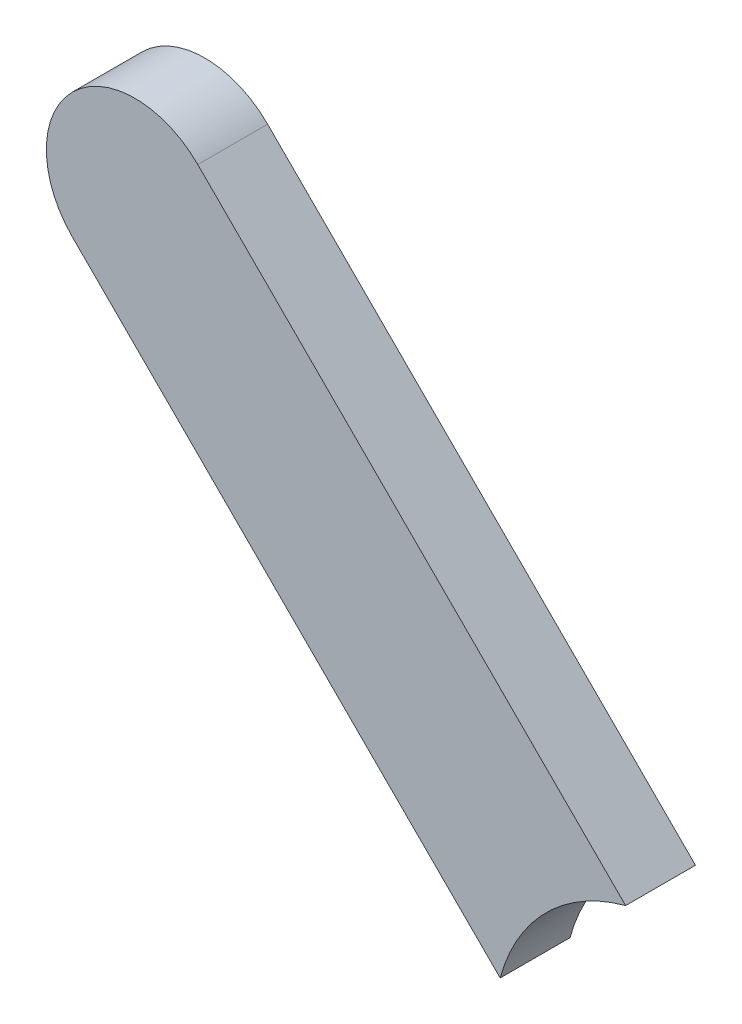
ISO-10303-21;
HEADER;
FILE_DESCRIPTION(('STEP AP214'),'2;1');
FILE_NAME('part.step','',(''),(''),'','','');
FILE_SCHEMA(('AUTOMOTIVE_DESIGN { 1 0 10303 214 1 1 1 1 }'));
ENDSEC;
DATA;
#1=APPLICATION_CONTEXT('core data for automotive mechanical design processes');
#2=APPLICATION_PROTOCOL_DEFINITION('international standard','automotive_design',2000,#1);
#3=PRODUCT_CONTEXT('',#1,'mechanical');
#4=PRODUCT('Part','Part','',(#3));
#5=PRODUCT_RELATED_PRODUCT_CATEGORY('part','',(#4));
#6=PRODUCT_DEFINITION_FORMATION('','',#4);
#7=PRODUCT_DEFINITION_CONTEXT('part definition',#1,'design');
#8=PRODUCT_DEFINITION('design','',#6,#7);
#9=PRODUCT_DEFINITION_SHAPE('','',#8);
#10=(LENGTH_UNIT() NAMED_UNIT(*) SI_UNIT(.MILLI.,.METRE.));
#11=(NAMED_UNIT(*) PLANE_ANGLE_UNIT() SI_UNIT($,.RADIAN.));
#12=(NAMED_UNIT(*) SI_UNIT($,.STERADIAN.) SOLID_ANGLE_UNIT());
#13=UNCERTAINTY_MEASURE_WITH_UNIT(LENGTH_MEASURE(1.E-05),#10,'distance_accuracy_value','');
#14=(GEOMETRIC_REPRESENTATION_CONTEXT(3) GLOBAL_UNCERTAINTY_ASSIGNED_CONTEXT((#13)) GLOBAL_UNIT_ASSIGNED_CONTEXT((#10,
#11,#12)) REPRESENTATION_CONTEXT('',''));
#15=CARTESIAN_POINT('',(0.,0.,0.));
#16=DIRECTION('',(0.,0.,1.));
#17=DIRECTION('',(1.,0.,0.));
#18=AXIS2_PLACEMENT_3D('',#15,#16,#17);
#19=CARTESIAN_POINT('',(151.06520206,84.16058606,0.));
#20=DIRECTION('',(0.707106781186548,0.707106781186548,0.));
#21=DIRECTION('',(0.707106781186548,-0.707106781186548,0.));
#22=AXIS2_PLACEMENT_3D('',#19,#20,#21);
#23=PLANE('',#22);
#24=DIRECTION('',(0.707106781186548,-0.707106781186548,0.));
#25=VECTOR('',#24,1.);
#26=CARTESIAN_POINT('',(151.06520206,84.16058606,0.1999996));
#27=LINE('',#26,#25);
#28=CARTESIAN_POINT('',(151.06520206,84.16058606,0.1999996));
#29=VERTEX_POINT('',#28);
#30=CARTESIAN_POINT('',(152.290309334697,82.9354787853028,0.1999996));
#31=VERTEX_POINT('',#30);
#32=EDGE_CURVE('E11',#29,#31,#27,.T.);
#33=ORIENTED_EDGE('',*,*,#32,.F.);
#34=DIRECTION('',(0.,0.,1.));
#35=VECTOR('',#34,1.);
#36=CARTESIAN_POINT('',(151.06520206,84.16058606,0.));
#37=LINE('',#36,#35);
#38=CARTESIAN_POINT('',(151.06520206,84.16058606,0.));
#39=VERTEX_POINT('',#38);
#40=EDGE_CURVE('E24',#39,#29,#37,.T.);
#41=ORIENTED_EDGE('',*,*,#40,.F.);
#42=DIRECTION('',(0.707106781186548,-0.707106781186548,0.));
#43=VECTOR('',#42,1.);
#44=CARTESIAN_POINT('',(151.06520206,84.16058606,0.));
#45=LINE('',#44,#43);
#46=CARTESIAN_POINT('',(152.290309334697,82.9354787853028,0.));
#47=VERTEX_POINT('',#46);
#48=EDGE_CURVE('E75',#39,#47,#45,.T.);
#49=ORIENTED_EDGE('',*,*,#48,.T.);
#50=DIRECTION('',(0.,0.,1.));
#51=VECTOR('',#50,1.);
#52=CARTESIAN_POINT('',(152.290309334697,82.9354787853028,0.));
#53=LINE('',#52,#51);
#54=EDGE_CURVE('E37',#47,#31,#53,.T.);
#55=ORIENTED_EDGE('',*,*,#54,.T.);
#56=EDGE_LOOP('',(#33,#41,#49,#55));
#57=FACE_BOUND('',#56,.T.);
#58=ADVANCED_FACE('F17',(#57),#23,.F.);
#59=CARTESIAN_POINT('',(152.781,82.804,0.));
#60=DIRECTION('',(0.,0.,-1.));
#61=DIRECTION('',(1.,0.,0.));
#62=AXIS2_PLACEMENT_3D('',#59,#60,#61);
#63=CYLINDRICAL_SURFACE('',#62,0.508);
#64=DIRECTION('',(0.,0.,1.));
#65=VECTOR('',#64,1.);
#66=CARTESIAN_POINT('',(152.649521214697,83.2946906653028,0.));
#67=LINE('',#66,#65);
#68=CARTESIAN_POINT('',(152.649521214697,83.2946906653028,0.));
#69=VERTEX_POINT('',#68);
#70=CARTESIAN_POINT('',(152.649521214697,83.2946906653028,0.1999996));
#71=VERTEX_POINT('',#70);
#72=EDGE_CURVE('E67',#69,#71,#67,.T.);
#73=ORIENTED_EDGE('',*,*,#72,.T.);
#74=CARTESIAN_POINT('',(152.781,82.804,0.1999996));
#75=DIRECTION('',(0.,0.,1.));
#76=DIRECTION('',(1.,0.,0.));
#77=AXIS2_PLACEMENT_3D('',#74,#75,#76);
#78=CIRCLE('',#77,0.508);
#79=EDGE_CURVE('E82',#71,#31,#78,.T.);
#80=ORIENTED_EDGE('',*,*,#79,.T.);
#81=ORIENTED_EDGE('',*,*,#54,.F.);
#82=CARTESIAN_POINT('',(152.781,82.804,0.));
#83=DIRECTION('',(0.,0.,1.));
#84=DIRECTION('',(1.,0.,0.));
#85=AXIS2_PLACEMENT_3D('',#82,#83,#84);
#86=CIRCLE('',#85,0.508);
#87=EDGE_CURVE('E80',#69,#47,#86,.T.);
#88=ORIENTED_EDGE('',*,*,#87,.F.);
#89=EDGE_LOOP('',(#73,#80,#81,#88));
#90=FACE_BOUND('',#89,.T.);
#91=ADVANCED_FACE('F88',(#90),#63,.F.);
#92=CARTESIAN_POINT('',(152.649521214697,83.2946906653028,0.));
#93=DIRECTION('',(-0.707106781186548,-0.707106781186548,0.));
#94=DIRECTION('',(-0.707106781186548,0.707106781186548,0.));
#95=AXIS2_PLACEMENT_3D('',#92,#93,#94);
#96=PLANE('',#95);
#97=DIRECTION('',(-0.707106781186548,0.707106781186548,0.));
#98=VECTOR('',#97,1.);
#99=CARTESIAN_POINT('',(152.96060594,82.98360594,0.1999996));
#100=LINE('',#99,#98);
#101=CARTESIAN_POINT('',(151.42441394,84.51979794,0.1999996));
#102=VERTEX_POINT('',#101);
#103=EDGE_CURVE('E71',#71,#102,#100,.T.);
#104=ORIENTED_EDGE('',*,*,#103,.F.);
#105=ORIENTED_EDGE('',*,*,#72,.F.);
#106=DIRECTION('',(-0.707106781186548,0.707106781186548,0.));
#107=VECTOR('',#106,1.);
#108=CARTESIAN_POINT('',(152.96060594,82.98360594,0.));
#109=LINE('',#108,#107);
#110=CARTESIAN_POINT('',(151.42441394,84.51979794,0.));
#111=VERTEX_POINT('',#110);
#112=EDGE_CURVE('E63',#69,#111,#109,.T.);
#113=ORIENTED_EDGE('',*,*,#112,.T.);
#114=DIRECTION('',(0.,0.,1.));
#115=VECTOR('',#114,1.);
#116=CARTESIAN_POINT('',(151.42441394,84.51979794,0.));
#117=LINE('',#116,#115);
#118=EDGE_CURVE('E53',#111,#102,#117,.T.);
#119=ORIENTED_EDGE('',*,*,#118,.T.);
#120=EDGE_LOOP('',(#104,#105,#113,#119));
#121=FACE_BOUND('',#120,.T.);
#122=ADVANCED_FACE('F66',(#121),#96,.F.);
#123=CARTESIAN_POINT('',(151.244808,84.340192,0.));
#124=DIRECTION('',(0.,0.,-1.));
#125=DIRECTION('',(0.707106781186604,0.707106781186492,0.));
#126=AXIS2_PLACEMENT_3D('',#123,#124,#125);
#127=CYLINDRICAL_SURFACE('',#126,0.254001156230761);
#128=CARTESIAN_POINT('',(151.244808,84.340192,0.1999996));
#129=DIRECTION('',(0.,0.,1.));
#130=DIRECTION('',(0.707106781186604,0.707106781186492,0.));
#131=AXIS2_PLACEMENT_3D('',#128,#129,#130);
#132=CIRCLE('',#131,0.254001156230761);
#133=EDGE_CURVE('E59',#102,#29,#132,.T.);
#134=ORIENTED_EDGE('',*,*,#133,.F.);
#135=ORIENTED_EDGE('',*,*,#118,.F.);
#136=CARTESIAN_POINT('',(151.244808,84.340192,0.));
#137=DIRECTION('',(0.,0.,1.));
#138=DIRECTION('',(0.707106781186604,0.707106781186492,0.));
#139=AXIS2_PLACEMENT_3D('',#136,#137,#138);
#140=CIRCLE('',#139,0.254001156230761);
#141=EDGE_CURVE('E57',#111,#39,#140,.T.);
#142=ORIENTED_EDGE('',*,*,#141,.T.);
#143=ORIENTED_EDGE('',*,*,#40,.T.);
#144=EDGE_LOOP('',(#134,#135,#142,#143));
#145=FACE_BOUND('',#144,.T.);
#146=ADVANCED_FACE('F55',(#145),#127,.T.);
#147=CARTESIAN_POINT('',(151.06520206,84.16058606,0.));
#148=DIRECTION('',(0.,0.,-1.));
#149=DIRECTION('',(-1.,0.,0.));
#150=AXIS2_PLACEMENT_3D('',#147,#148,#149);
#151=PLANE('',#150);
#152=ORIENTED_EDGE('',*,*,#48,.F.);
#153=ORIENTED_EDGE('',*,*,#141,.F.);
#154=ORIENTED_EDGE('',*,*,#112,.F.);
#155=ORIENTED_EDGE('',*,*,#87,.T.);
#156=EDGE_LOOP('',(#152,#153,#154,#155));
#157=FACE_BOUND('',#156,.T.);
#158=ADVANCED_FACE('F74',(#157),#151,.T.);
#159=CARTESIAN_POINT('',(151.06520206,84.16058606,0.1999996));
#160=DIRECTION('',(0.,0.,-1.));
#161=DIRECTION('',(-1.,0.,0.));
#162=AXIS2_PLACEMENT_3D('',#159,#160,#161);
#163=PLANE('',#162);
#164=ORIENTED_EDGE('',*,*,#133,.T.);
#165=ORIENTED_EDGE('',*,*,#32,.T.);
#166=ORIENTED_EDGE('',*,*,#79,.F.);
#167=ORIENTED_EDGE('',*,*,#103,.T.);
#168=EDGE_LOOP('',(#164,#165,#166,#167));
#169=FACE_BOUND('',#168,.T.);
#170=ADVANCED_FACE('F91',(#169),#163,.F.);
#171=CLOSED_SHELL('',(#58,#91,#122,#146,#158,#170));
#172=MANIFOLD_SOLID_BREP('B1',#171);
#173=ADVANCED_BREP_SHAPE_REPRESENTATION('',(#18,#172),#14);
#174=SHAPE_DEFINITION_REPRESENTATION(#9,#173);
ENDSEC;
END-ISO-10303-21;
